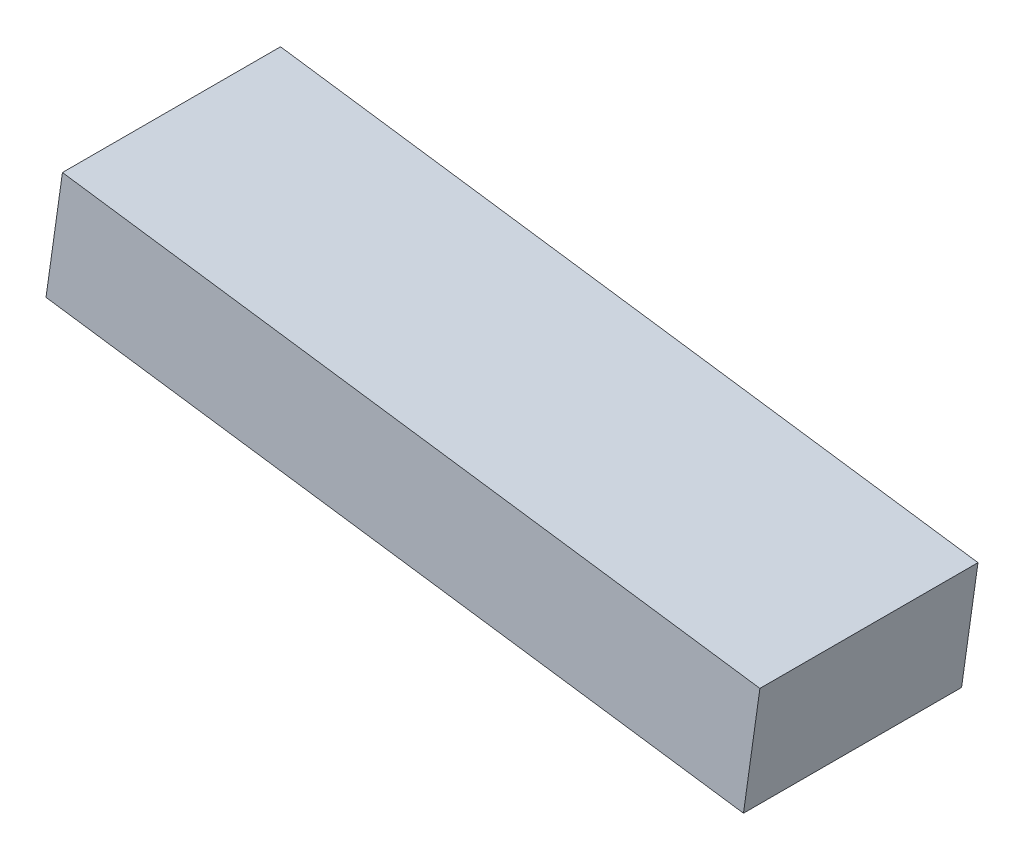
ISO-10303-21;
HEADER;
FILE_DESCRIPTION(('STEP AP214'),'2;1');
FILE_NAME('part.step','',(''),(''),'','','');
FILE_SCHEMA(('AUTOMOTIVE_DESIGN { 1 0 10303 214 1 1 1 1 }'));
ENDSEC;
DATA;
#1=APPLICATION_CONTEXT('core data for automotive mechanical design processes');
#2=APPLICATION_PROTOCOL_DEFINITION('international standard','automotive_design',2000,#1);
#3=PRODUCT_CONTEXT('',#1,'mechanical');
#4=PRODUCT('Part','Part','',(#3));
#5=PRODUCT_RELATED_PRODUCT_CATEGORY('part','',(#4));
#6=PRODUCT_DEFINITION_FORMATION('','',#4);
#7=PRODUCT_DEFINITION_CONTEXT('part definition',#1,'design');
#8=PRODUCT_DEFINITION('design','',#6,#7);
#9=PRODUCT_DEFINITION_SHAPE('','',#8);
#10=(LENGTH_UNIT() NAMED_UNIT(*) SI_UNIT(.MILLI.,.METRE.));
#11=(NAMED_UNIT(*) PLANE_ANGLE_UNIT() SI_UNIT($,.RADIAN.));
#12=(NAMED_UNIT(*) SI_UNIT($,.STERADIAN.) SOLID_ANGLE_UNIT());
#13=UNCERTAINTY_MEASURE_WITH_UNIT(LENGTH_MEASURE(1.E-05),#10,'distance_accuracy_value','');
#14=(GEOMETRIC_REPRESENTATION_CONTEXT(3) GLOBAL_UNCERTAINTY_ASSIGNED_CONTEXT((#13)) GLOBAL_UNIT_ASSIGNED_CONTEXT((#10,
#11,#12)) REPRESENTATION_CONTEXT('',''));
#15=CARTESIAN_POINT('',(0.,0.,0.));
#16=DIRECTION('',(0.,0.,1.));
#17=DIRECTION('',(1.,0.,0.));
#18=AXIS2_PLACEMENT_3D('',#15,#16,#17);
#19=CARTESIAN_POINT('',(740.10988283336,631.671810266154,1634.86424492161));
#20=DIRECTION('',(0.990268068741567,-0.139173100960088,0.));
#21=DIRECTION('',(-0.000106014336864278,-0.000754331202662602,-0.999999709872657));
#22=AXIS2_PLACEMENT_3D('',#19,#20,#21);
#23=PLANE('',#22);
#24=CARTESIAN_POINT('',(738.718152227538,621.769132451777,1634.87186236608));
#25=CARTESIAN_POINT('',(738.719137162919,621.776140631163,1644.16244630092));
#26=CARTESIAN_POINT('',(738.7201220983,621.783148810549,1653.45303023575));
#27=B_SPLINE_CURVE_WITH_KNOTS('',2,(#24,#25,#26),.UNSPECIFIED.,.F.,.F.,(3,3),(0.,1.),.UNSPECIFIED.);
#28=CARTESIAN_POINT('',(738.718152227538,621.769132451777,1634.87186236608));
#29=VERTEX_POINT('',#28);
#30=CARTESIAN_POINT('',(738.7201220983,621.783148810549,1653.45303023575));
#31=VERTEX_POINT('',#30);
#32=EDGE_CURVE('E89',#29,#31,#27,.T.);
#33=ORIENTED_EDGE('',*,*,#32,.F.);
#34=DIRECTION('',(-0.139173060582166,-0.990267781437723,0.000761744447259827));
#35=VECTOR('',#34,1.);
#36=CARTESIAN_POINT('',(740.10988283336,631.671810266154,1634.86424492161));
#37=LINE('',#36,#35);
#38=CARTESIAN_POINT('',(740.10988283336,631.671810266154,1634.86424492161));
#39=VERTEX_POINT('',#38);
#40=EDGE_CURVE('E33',#39,#29,#37,.T.);
#41=ORIENTED_EDGE('',*,*,#40,.F.);
#42=CARTESIAN_POINT('',(740.10988283336,631.671810266154,1634.86424492161));
#43=CARTESIAN_POINT('',(740.110867768741,631.67881844554,1644.15482885644));
#44=CARTESIAN_POINT('',(740.111852704121,631.685826624926,1653.44541279128));
#45=B_SPLINE_CURVE_WITH_KNOTS('',2,(#42,#43,#44),.UNSPECIFIED.,.F.,.F.,(3,3),(0.,1.),.UNSPECIFIED.);
#46=CARTESIAN_POINT('',(740.111852704121,631.685826624926,1653.44541279128));
#47=VERTEX_POINT('',#46);
#48=EDGE_CURVE('E72',#39,#47,#45,.T.);
#49=ORIENTED_EDGE('',*,*,#48,.T.);
#50=DIRECTION('',(-0.139173060582166,-0.990267781437723,0.000761744447259827));
#51=VECTOR('',#50,1.);
#52=CARTESIAN_POINT('',(740.111852704121,631.685826624926,1653.44541279128));
#53=LINE('',#52,#51);
#54=EDGE_CURVE('E11',#47,#31,#53,.T.);
#55=ORIENTED_EDGE('',*,*,#54,.T.);
#56=EDGE_LOOP('',(#33,#41,#49,#55));
#57=FACE_BOUND('',#56,.T.);
#58=ADVANCED_FACE('F17',(#57),#23,.T.);
#59=CARTESIAN_POINT('',(740.111852704121,631.685826624926,1653.44541279128));
#60=DIRECTION('',(0.000106014336864278,0.000754331202662602,0.999999709872657));
#61=DIRECTION('',(0.990268068741567,-0.139173100960088,0.));
#62=AXIS2_PLACEMENT_3D('',#59,#60,#61);
#63=PLANE('',#62);
#64=CARTESIAN_POINT('',(738.7201220983,621.783148810549,1653.45303023575));
#65=CARTESIAN_POINT('',(709.012080036053,625.958341839352,1653.45303023575));
#66=CARTESIAN_POINT('',(679.304037973805,630.133534868154,1653.45303023575));
#67=B_SPLINE_CURVE_WITH_KNOTS('',2,(#64,#65,#66),.UNSPECIFIED.,.F.,.F.,(3,3),(1.,2.),.UNSPECIFIED.);
#68=CARTESIAN_POINT('',(679.304037973805,630.133534868154,1653.45303023575));
#69=VERTEX_POINT('',#68);
#70=EDGE_CURVE('E97',#31,#69,#67,.T.);
#71=ORIENTED_EDGE('',*,*,#70,.F.);
#72=ORIENTED_EDGE('',*,*,#54,.F.);
#73=CARTESIAN_POINT('',(740.111852704121,631.685826624926,1653.44541279128));
#74=CARTESIAN_POINT('',(710.403810641874,635.861019653729,1653.44541279128));
#75=CARTESIAN_POINT('',(680.695768579627,640.036212682532,1653.44541279128));
#76=B_SPLINE_CURVE_WITH_KNOTS('',2,(#73,#74,#75),.UNSPECIFIED.,.F.,.F.,(3,3),(1.,2.),.UNSPECIFIED.);
#77=CARTESIAN_POINT('',(680.695768579627,640.036212682532,1653.44541279128));
#78=VERTEX_POINT('',#77);
#79=EDGE_CURVE('E68',#47,#78,#76,.T.);
#80=ORIENTED_EDGE('',*,*,#79,.T.);
#81=DIRECTION('',(-0.139173060582166,-0.990267781437723,0.000761744447259827));
#82=VECTOR('',#81,1.);
#83=CARTESIAN_POINT('',(680.695768579627,640.036212682532,1653.44541279128));
#84=LINE('',#83,#82);
#85=EDGE_CURVE('E25',#78,#69,#84,.T.);
#86=ORIENTED_EDGE('',*,*,#85,.T.);
#87=EDGE_LOOP('',(#71,#72,#80,#86));
#88=FACE_BOUND('',#87,.T.);
#89=ADVANCED_FACE('F69',(#88),#63,.T.);
#90=CARTESIAN_POINT('',(680.695768579627,640.036212682532,1653.44541279128));
#91=DIRECTION('',(-0.990268068741567,0.139173100960088,0.));
#92=DIRECTION('',(0.000106014336864278,0.000754331202662602,0.999999709872657));
#93=AXIS2_PLACEMENT_3D('',#90,#91,#92);
#94=PLANE('',#93);
#95=CARTESIAN_POINT('',(679.304037973805,630.133534868154,1653.45303023575));
#96=CARTESIAN_POINT('',(679.303053038425,630.126526688768,1644.16244630092));
#97=CARTESIAN_POINT('',(679.302068103044,630.119518509382,1634.87186236608));
#98=B_SPLINE_CURVE_WITH_KNOTS('',2,(#95,#96,#97),.UNSPECIFIED.,.F.,.F.,(3,3),(2.,3.),.UNSPECIFIED.);
#99=CARTESIAN_POINT('',(679.302068103044,630.119518509382,1634.87186236608));
#100=VERTEX_POINT('',#99);
#101=EDGE_CURVE('E66',#69,#100,#98,.T.);
#102=ORIENTED_EDGE('',*,*,#101,.F.);
#103=ORIENTED_EDGE('',*,*,#85,.F.);
#104=CARTESIAN_POINT('',(680.695768579627,640.036212682532,1653.44541279128));
#105=CARTESIAN_POINT('',(680.694783644246,640.029204503145,1644.15482885644));
#106=CARTESIAN_POINT('',(680.693798708866,640.022196323759,1634.86424492161));
#107=B_SPLINE_CURVE_WITH_KNOTS('',2,(#104,#105,#106),.UNSPECIFIED.,.F.,.F.,(3,3),(2.,3.),.UNSPECIFIED.);
#108=CARTESIAN_POINT('',(680.693798708866,640.022196323759,1634.86424492161));
#109=VERTEX_POINT('',#108);
#110=EDGE_CURVE('E63',#78,#109,#107,.T.);
#111=ORIENTED_EDGE('',*,*,#110,.T.);
#112=DIRECTION('',(-0.139173060582166,-0.990267781437723,0.000761744447259827));
#113=VECTOR('',#112,1.);
#114=CARTESIAN_POINT('',(680.693798708866,640.022196323759,1634.86424492161));
#115=LINE('',#114,#113);
#116=EDGE_CURVE('E49',#109,#100,#115,.T.);
#117=ORIENTED_EDGE('',*,*,#116,.T.);
#118=EDGE_LOOP('',(#102,#103,#111,#117));
#119=FACE_BOUND('',#118,.T.);
#120=ADVANCED_FACE('F61',(#119),#94,.T.);
#121=CARTESIAN_POINT('',(680.693798708866,640.022196323759,1634.86424492161));
#122=DIRECTION('',(-0.000106014336864278,-0.000754331202662602,-0.999999709872657));
#123=DIRECTION('',(-0.990268068741567,0.139173100960088,0.));
#124=AXIS2_PLACEMENT_3D('',#121,#122,#123);
#125=PLANE('',#124);
#126=CARTESIAN_POINT('',(679.302068103044,630.119518509382,1634.87186236608));
#127=CARTESIAN_POINT('',(709.010110165291,625.944325480579,1634.87186236608));
#128=CARTESIAN_POINT('',(738.718152227538,621.769132451777,1634.87186236608));
#129=B_SPLINE_CURVE_WITH_KNOTS('',2,(#126,#127,#128),.UNSPECIFIED.,.F.,.F.,(3,3),(3.,4.),.UNSPECIFIED.);
#130=EDGE_CURVE('E110',#100,#29,#129,.T.);
#131=ORIENTED_EDGE('',*,*,#130,.F.);
#132=ORIENTED_EDGE('',*,*,#116,.F.);
#133=CARTESIAN_POINT('',(680.693798708866,640.022196323759,1634.86424492161));
#134=CARTESIAN_POINT('',(710.401840771113,635.847003294957,1634.86424492161));
#135=CARTESIAN_POINT('',(740.10988283336,631.671810266154,1634.86424492161));
#136=B_SPLINE_CURVE_WITH_KNOTS('',2,(#133,#134,#135),.UNSPECIFIED.,.F.,.F.,(3,3),(3.,4.),.UNSPECIFIED.);
#137=EDGE_CURVE('E75',#109,#39,#136,.T.);
#138=ORIENTED_EDGE('',*,*,#137,.T.);
#139=ORIENTED_EDGE('',*,*,#40,.T.);
#140=EDGE_LOOP('',(#131,#132,#138,#139));
#141=FACE_BOUND('',#140,.T.);
#142=ADVANCED_FACE('F134',(#141),#125,.T.);
#143=CARTESIAN_POINT('',(740.110867768741,631.67881844554,1644.15482885644));
#144=DIRECTION('',(0.139173060582166,0.990267781437723,-0.000761744447259827));
#145=DIRECTION('',(0.000106014336864278,0.000754331202662602,0.999999709872657));
#146=AXIS2_PLACEMENT_3D('',#143,#144,#145);
#147=PLANE('',#146);
#148=ORIENTED_EDGE('',*,*,#48,.F.);
#149=ORIENTED_EDGE('',*,*,#137,.F.);
#150=ORIENTED_EDGE('',*,*,#110,.F.);
#151=ORIENTED_EDGE('',*,*,#79,.F.);
#152=EDGE_LOOP('',(#148,#149,#150,#151));
#153=FACE_BOUND('',#152,.T.);
#154=ADVANCED_FACE('F74',(#153),#147,.T.);
#155=CARTESIAN_POINT('',(738.719137162919,621.776140631163,1644.16244630092));
#156=DIRECTION('',(0.139173060582166,0.990267781437723,-0.000761744447259827));
#157=DIRECTION('',(0.000106014336864278,0.000754331202662602,0.999999709872657));
#158=AXIS2_PLACEMENT_3D('',#155,#156,#157);
#159=PLANE('',#158);
#160=ORIENTED_EDGE('',*,*,#32,.T.);
#161=ORIENTED_EDGE('',*,*,#70,.T.);
#162=ORIENTED_EDGE('',*,*,#101,.T.);
#163=ORIENTED_EDGE('',*,*,#130,.T.);
#164=EDGE_LOOP('',(#160,#161,#162,#163));
#165=FACE_BOUND('',#164,.T.);
#166=ADVANCED_FACE('F127',(#165),#159,.F.);
#167=CLOSED_SHELL('',(#58,#89,#120,#142,#154,#166));
#168=MANIFOLD_SOLID_BREP('B1',#167);
#169=ADVANCED_BREP_SHAPE_REPRESENTATION('',(#18,#168),#14);
#170=SHAPE_DEFINITION_REPRESENTATION(#9,#169);
ENDSEC;
END-ISO-10303-21;
